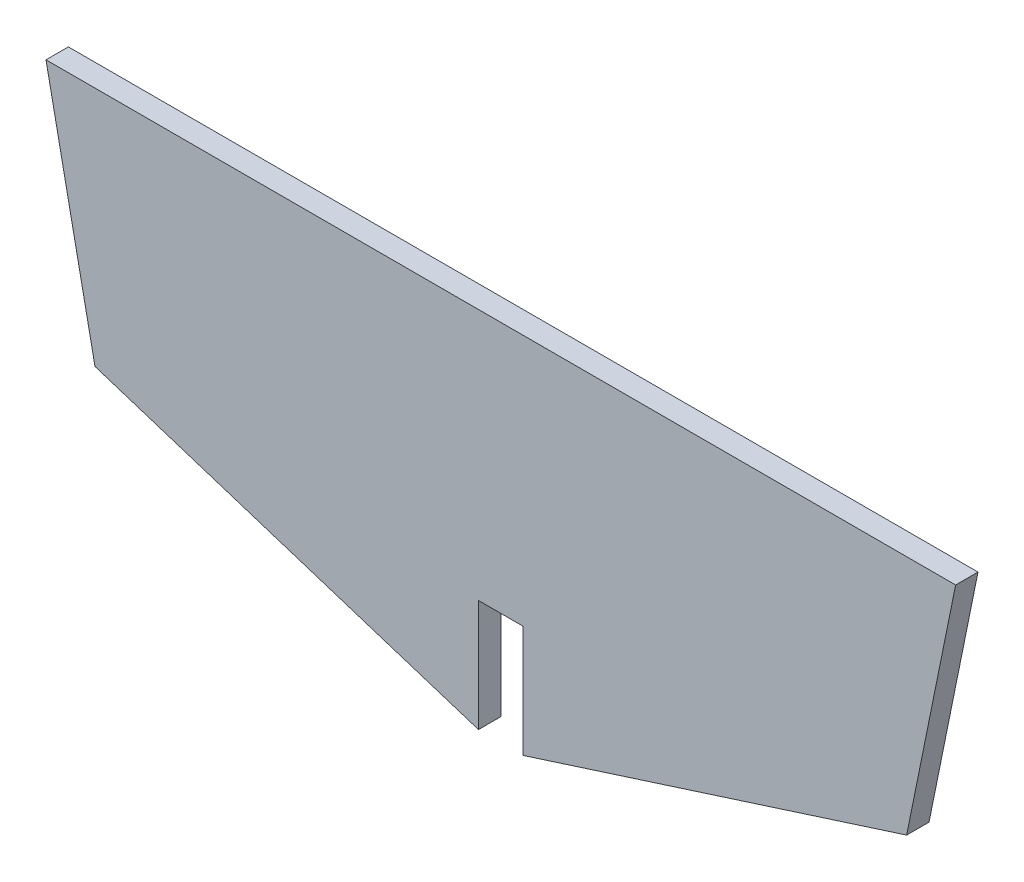
ISO-10303-21;
HEADER;
FILE_DESCRIPTION(('STEP AP214'),'2;1');
FILE_NAME('part.step','',(''),(''),'','','');
FILE_SCHEMA(('AUTOMOTIVE_DESIGN { 1 0 10303 214 1 1 1 1 }'));
ENDSEC;
DATA;
#1=APPLICATION_CONTEXT('core data for automotive mechanical design processes');
#2=APPLICATION_PROTOCOL_DEFINITION('international standard','automotive_design',2000,#1);
#3=PRODUCT_CONTEXT('',#1,'mechanical');
#4=PRODUCT('Part','Part','',(#3));
#5=PRODUCT_RELATED_PRODUCT_CATEGORY('part','',(#4));
#6=PRODUCT_DEFINITION_FORMATION('','',#4);
#7=PRODUCT_DEFINITION_CONTEXT('part definition',#1,'design');
#8=PRODUCT_DEFINITION('design','',#6,#7);
#9=PRODUCT_DEFINITION_SHAPE('','',#8);
#10=(LENGTH_UNIT() NAMED_UNIT(*) SI_UNIT(.MILLI.,.METRE.));
#11=(NAMED_UNIT(*) PLANE_ANGLE_UNIT() SI_UNIT($,.RADIAN.));
#12=(NAMED_UNIT(*) SI_UNIT($,.STERADIAN.) SOLID_ANGLE_UNIT());
#13=UNCERTAINTY_MEASURE_WITH_UNIT(LENGTH_MEASURE(1.E-05),#10,'distance_accuracy_value','');
#14=(GEOMETRIC_REPRESENTATION_CONTEXT(3) GLOBAL_UNCERTAINTY_ASSIGNED_CONTEXT((#13)) GLOBAL_UNIT_ASSIGNED_CONTEXT((#10,
#11,#12)) REPRESENTATION_CONTEXT('',''));
#15=CARTESIAN_POINT('',(0.,0.,0.));
#16=DIRECTION('',(0.,0.,1.));
#17=DIRECTION('',(1.,0.,0.));
#18=AXIS2_PLACEMENT_3D('',#15,#16,#17);
#19=CARTESIAN_POINT('',(-26.4234133480288,16.431604978547,3.));
#20=DIRECTION('',(0.979981210042111,0.199089999659449,0.));
#21=DIRECTION('',(-0.199089999659449,0.979981210042111,0.));
#22=AXIS2_PLACEMENT_3D('',#19,#20,#21);
#23=PLANE('',#22);
#24=DIRECTION('',(0.199089999659449,-0.979981210042111,0.));
#25=VECTOR('',#24,1.);
#26=CARTESIAN_POINT('',(-26.4234133480288,16.431604978547,0.));
#27=LINE('',#26,#25);
#28=CARTESIAN_POINT('',(-26.4234133480288,16.431604978547,0.));
#29=VERTEX_POINT('',#28);
#30=CARTESIAN_POINT('',(-19.853443359267,-15.9077749528427,0.));
#31=VERTEX_POINT('',#30);
#32=EDGE_CURVE('E130',#29,#31,#27,.T.);
#33=ORIENTED_EDGE('',*,*,#32,.T.);
#34=DIRECTION('',(0.,0.,-1.));
#35=VECTOR('',#34,1.);
#36=CARTESIAN_POINT('',(-19.853443359267,-15.9077749528427,3.));
#37=LINE('',#36,#35);
#38=CARTESIAN_POINT('',(-19.853443359267,-15.9077749528427,3.));
#39=VERTEX_POINT('',#38);
#40=EDGE_CURVE('E11',#39,#31,#37,.T.);
#41=ORIENTED_EDGE('',*,*,#40,.F.);
#42=DIRECTION('',(0.199089999659449,-0.979981210042111,0.));
#43=VECTOR('',#42,1.);
#44=CARTESIAN_POINT('',(-26.4234133480288,16.431604978547,3.));
#45=LINE('',#44,#43);
#46=CARTESIAN_POINT('',(-26.4234133480288,16.431604978547,3.));
#47=VERTEX_POINT('',#46);
#48=EDGE_CURVE('E144',#47,#39,#45,.T.);
#49=ORIENTED_EDGE('',*,*,#48,.F.);
#50=DIRECTION('',(0.,0.,-1.));
#51=VECTOR('',#50,1.);
#52=CARTESIAN_POINT('',(-26.4234133480288,16.431604978547,3.));
#53=LINE('',#52,#51);
#54=EDGE_CURVE('E126',#47,#29,#53,.T.);
#55=ORIENTED_EDGE('',*,*,#54,.T.);
#56=EDGE_LOOP('',(#33,#41,#49,#55));
#57=FACE_BOUND('',#56,.T.);
#58=ADVANCED_FACE('F34',(#57),#23,.F.);
#59=CARTESIAN_POINT('',(-19.853443359267,-15.9077749528427,3.));
#60=DIRECTION('',(0.304826297566858,0.952407963171078,0.));
#61=DIRECTION('',(-0.952407963171078,0.304826297566858,0.));
#62=AXIS2_PLACEMENT_3D('',#59,#60,#61);
#63=PLANE('',#62);
#64=DIRECTION('',(0.952407963171078,-0.304826297566858,0.));
#65=VECTOR('',#64,1.);
#66=CARTESIAN_POINT('',(-19.853443359267,-15.9077749528427,0.));
#67=LINE('',#66,#65);
#68=CARTESIAN_POINT('',(31.5765866519712,-32.368395021453,0.));
#69=VERTEX_POINT('',#68);
#70=EDGE_CURVE('E133',#31,#69,#67,.T.);
#71=ORIENTED_EDGE('',*,*,#70,.T.);
#72=DIRECTION('',(0.,0.,-1.));
#73=VECTOR('',#72,1.);
#74=CARTESIAN_POINT('',(31.5765866519712,-32.368395021453,3.));
#75=LINE('',#74,#73);
#76=CARTESIAN_POINT('',(31.5765866519712,-32.368395021453,3.));
#77=VERTEX_POINT('',#76);
#78=EDGE_CURVE('E42',#77,#69,#75,.T.);
#79=ORIENTED_EDGE('',*,*,#78,.F.);
#80=DIRECTION('',(0.952407963171078,-0.304826297566858,0.));
#81=VECTOR('',#80,1.);
#82=CARTESIAN_POINT('',(-19.853443359267,-15.9077749528427,3.));
#83=LINE('',#82,#81);
#84=EDGE_CURVE('E93',#39,#77,#83,.T.);
#85=ORIENTED_EDGE('',*,*,#84,.F.);
#86=ORIENTED_EDGE('',*,*,#40,.T.);
#87=EDGE_LOOP('',(#71,#79,#85,#86));
#88=FACE_BOUND('',#87,.T.);
#89=ADVANCED_FACE('F179',(#88),#63,.F.);
#90=CARTESIAN_POINT('',(31.5765866519712,-32.368395021453,3.));
#91=DIRECTION('',(-1.,0.,0.));
#92=DIRECTION('',(0.,0.,1.));
#93=AXIS2_PLACEMENT_3D('',#90,#91,#92);
#94=PLANE('',#93);
#95=DIRECTION('',(0.,1.,0.));
#96=VECTOR('',#95,1.);
#97=CARTESIAN_POINT('',(31.5765866519712,-32.368395021453,0.));
#98=LINE('',#97,#96);
#99=CARTESIAN_POINT('',(31.5765866519712,-17.368395021453,0.));
#100=VERTEX_POINT('',#99);
#101=EDGE_CURVE('E135',#69,#100,#98,.T.);
#102=ORIENTED_EDGE('',*,*,#101,.T.);
#103=DIRECTION('',(0.,0.,-1.));
#104=VECTOR('',#103,1.);
#105=CARTESIAN_POINT('',(31.5765866519712,-17.368395021453,3.));
#106=LINE('',#105,#104);
#107=CARTESIAN_POINT('',(31.5765866519712,-17.368395021453,3.));
#108=VERTEX_POINT('',#107);
#109=EDGE_CURVE('E151',#108,#100,#106,.T.);
#110=ORIENTED_EDGE('',*,*,#109,.F.);
#111=DIRECTION('',(0.,1.,0.));
#112=VECTOR('',#111,1.);
#113=CARTESIAN_POINT('',(31.5765866519712,-32.368395021453,3.));
#114=LINE('',#113,#112);
#115=EDGE_CURVE('E159',#77,#108,#114,.T.);
#116=ORIENTED_EDGE('',*,*,#115,.F.);
#117=ORIENTED_EDGE('',*,*,#78,.T.);
#118=EDGE_LOOP('',(#102,#110,#116,#117));
#119=FACE_BOUND('',#118,.T.);
#120=ADVANCED_FACE('F157',(#119),#94,.F.);
#121=CARTESIAN_POINT('',(31.5765866519712,-17.368395021453,3.));
#122=DIRECTION('',(0.,1.,0.));
#123=DIRECTION('',(0.,0.,1.));
#124=AXIS2_PLACEMENT_3D('',#121,#122,#123);
#125=PLANE('',#124);
#126=DIRECTION('',(1.,0.,0.));
#127=VECTOR('',#126,1.);
#128=CARTESIAN_POINT('',(31.5765866519712,-17.368395021453,0.));
#129=LINE('',#128,#127);
#130=CARTESIAN_POINT('',(37.5765866519712,-17.368395021453,0.));
#131=VERTEX_POINT('',#130);
#132=EDGE_CURVE('E137',#100,#131,#129,.T.);
#133=ORIENTED_EDGE('',*,*,#132,.T.);
#134=DIRECTION('',(0.,0.,-1.));
#135=VECTOR('',#134,1.);
#136=CARTESIAN_POINT('',(37.5765866519712,-17.368395021453,3.));
#137=LINE('',#136,#135);
#138=CARTESIAN_POINT('',(37.5765866519712,-17.368395021453,3.));
#139=VERTEX_POINT('',#138);
#140=EDGE_CURVE('E148',#139,#131,#137,.T.);
#141=ORIENTED_EDGE('',*,*,#140,.F.);
#142=DIRECTION('',(1.,0.,0.));
#143=VECTOR('',#142,1.);
#144=CARTESIAN_POINT('',(31.5765866519712,-17.368395021453,3.));
#145=LINE('',#144,#143);
#146=EDGE_CURVE('E171',#108,#139,#145,.T.);
#147=ORIENTED_EDGE('',*,*,#146,.F.);
#148=ORIENTED_EDGE('',*,*,#109,.T.);
#149=EDGE_LOOP('',(#133,#141,#147,#148));
#150=FACE_BOUND('',#149,.T.);
#151=ADVANCED_FACE('F167',(#150),#125,.F.);
#152=CARTESIAN_POINT('',(37.5765866519712,-32.368395021453,3.));
#153=DIRECTION('',(1.,0.,0.));
#154=DIRECTION('',(0.,1.,0.));
#155=AXIS2_PLACEMENT_3D('',#152,#153,#154);
#156=PLANE('',#155);
#157=DIRECTION('',(0.,-1.,0.));
#158=VECTOR('',#157,1.);
#159=CARTESIAN_POINT('',(37.5765866519712,-32.368395021453,0.));
#160=LINE('',#159,#158);
#161=CARTESIAN_POINT('',(37.5765866519712,-32.368395021453,0.));
#162=VERTEX_POINT('',#161);
#163=EDGE_CURVE('E139',#131,#162,#160,.T.);
#164=ORIENTED_EDGE('',*,*,#163,.T.);
#165=DIRECTION('',(0.,0.,-1.));
#166=VECTOR('',#165,1.);
#167=CARTESIAN_POINT('',(37.5765866519712,-32.368395021453,3.));
#168=LINE('',#167,#166);
#169=CARTESIAN_POINT('',(37.5765866519712,-32.368395021453,3.));
#170=VERTEX_POINT('',#169);
#171=EDGE_CURVE('E121',#170,#162,#168,.T.);
#172=ORIENTED_EDGE('',*,*,#171,.F.);
#173=DIRECTION('',(0.,-1.,0.));
#174=VECTOR('',#173,1.);
#175=CARTESIAN_POINT('',(37.5765866519712,-32.368395021453,3.));
#176=LINE('',#175,#174);
#177=EDGE_CURVE('E112',#139,#170,#176,.T.);
#178=ORIENTED_EDGE('',*,*,#177,.F.);
#179=ORIENTED_EDGE('',*,*,#140,.T.);
#180=EDGE_LOOP('',(#164,#172,#178,#179));
#181=FACE_BOUND('',#180,.T.);
#182=ADVANCED_FACE('F170',(#181),#156,.F.);
#183=CARTESIAN_POINT('',(89.0066166632094,-15.9077749528427,3.));
#184=DIRECTION('',(-0.304826297566858,0.952407963171078,0.));
#185=DIRECTION('',(-0.952407963171078,-0.304826297566858,0.));
#186=AXIS2_PLACEMENT_3D('',#183,#184,#185);
#187=PLANE('',#186);
#188=DIRECTION('',(0.952407963171078,0.304826297566858,0.));
#189=VECTOR('',#188,1.);
#190=CARTESIAN_POINT('',(89.0066166632094,-15.9077749528427,0.));
#191=LINE('',#190,#189);
#192=CARTESIAN_POINT('',(89.0066166632094,-15.9077749528427,0.));
#193=VERTEX_POINT('',#192);
#194=EDGE_CURVE('E120',#162,#193,#191,.T.);
#195=ORIENTED_EDGE('',*,*,#194,.T.);
#196=DIRECTION('',(0.,0.,-1.));
#197=VECTOR('',#196,1.);
#198=CARTESIAN_POINT('',(89.0066166632094,-15.9077749528427,3.));
#199=LINE('',#198,#197);
#200=CARTESIAN_POINT('',(89.0066166632094,-15.9077749528427,3.));
#201=VERTEX_POINT('',#200);
#202=EDGE_CURVE('E117',#201,#193,#199,.T.);
#203=ORIENTED_EDGE('',*,*,#202,.F.);
#204=DIRECTION('',(0.952407963171078,0.304826297566858,0.));
#205=VECTOR('',#204,1.);
#206=CARTESIAN_POINT('',(89.0066166632094,-15.9077749528427,3.));
#207=LINE('',#206,#205);
#208=EDGE_CURVE('E106',#170,#201,#207,.T.);
#209=ORIENTED_EDGE('',*,*,#208,.F.);
#210=ORIENTED_EDGE('',*,*,#171,.T.);
#211=EDGE_LOOP('',(#195,#203,#209,#210));
#212=FACE_BOUND('',#211,.T.);
#213=ADVANCED_FACE('F118',(#212),#187,.F.);
#214=CARTESIAN_POINT('',(95.5765866519712,16.431604978547,3.));
#215=DIRECTION('',(-0.979981210042111,0.199089999659448,0.));
#216=DIRECTION('',(-0.199089999659448,-0.979981210042112,0.));
#217=AXIS2_PLACEMENT_3D('',#214,#215,#216);
#218=PLANE('',#217);
#219=DIRECTION('',(0.199089999659448,0.979981210042112,0.));
#220=VECTOR('',#219,1.);
#221=CARTESIAN_POINT('',(95.5765866519712,16.431604978547,0.));
#222=LINE('',#221,#220);
#223=CARTESIAN_POINT('',(95.5765866519712,16.431604978547,0.));
#224=VERTEX_POINT('',#223);
#225=EDGE_CURVE('E79',#193,#224,#222,.T.);
#226=ORIENTED_EDGE('',*,*,#225,.T.);
#227=DIRECTION('',(0.,0.,-1.));
#228=VECTOR('',#227,1.);
#229=CARTESIAN_POINT('',(95.5765866519712,16.431604978547,3.));
#230=LINE('',#229,#228);
#231=CARTESIAN_POINT('',(95.5765866519712,16.431604978547,3.));
#232=VERTEX_POINT('',#231);
#233=EDGE_CURVE('E122',#232,#224,#230,.T.);
#234=ORIENTED_EDGE('',*,*,#233,.F.);
#235=DIRECTION('',(0.199089999659448,0.979981210042112,0.));
#236=VECTOR('',#235,1.);
#237=CARTESIAN_POINT('',(95.5765866519712,16.431604978547,3.));
#238=LINE('',#237,#236);
#239=EDGE_CURVE('E110',#201,#232,#238,.T.);
#240=ORIENTED_EDGE('',*,*,#239,.F.);
#241=ORIENTED_EDGE('',*,*,#202,.T.);
#242=EDGE_LOOP('',(#226,#234,#240,#241));
#243=FACE_BOUND('',#242,.T.);
#244=ADVANCED_FACE('F124',(#243),#218,.F.);
#245=CARTESIAN_POINT('',(-26.4234133480288,16.431604978547,3.));
#246=DIRECTION('',(0.,-1.,0.));
#247=DIRECTION('',(1.,0.,0.));
#248=AXIS2_PLACEMENT_3D('',#245,#246,#247);
#249=PLANE('',#248);
#250=DIRECTION('',(-1.,0.,0.));
#251=VECTOR('',#250,1.);
#252=CARTESIAN_POINT('',(-26.4234133480288,16.431604978547,0.));
#253=LINE('',#252,#251);
#254=EDGE_CURVE('E85',#224,#29,#253,.T.);
#255=ORIENTED_EDGE('',*,*,#254,.T.);
#256=ORIENTED_EDGE('',*,*,#54,.F.);
#257=DIRECTION('',(-1.,0.,0.));
#258=VECTOR('',#257,1.);
#259=CARTESIAN_POINT('',(-26.4234133480288,16.431604978547,3.));
#260=LINE('',#259,#258);
#261=EDGE_CURVE('E50',#232,#47,#260,.T.);
#262=ORIENTED_EDGE('',*,*,#261,.F.);
#263=ORIENTED_EDGE('',*,*,#233,.T.);
#264=EDGE_LOOP('',(#255,#256,#262,#263));
#265=FACE_BOUND('',#264,.T.);
#266=ADVANCED_FACE('F195',(#265),#249,.F.);
#267=CARTESIAN_POINT('',(0.,0.,3.));
#268=DIRECTION('',(0.,0.,-1.));
#269=DIRECTION('',(-1.,0.,0.));
#270=AXIS2_PLACEMENT_3D('',#267,#268,#269);
#271=PLANE('',#270);
#272=ORIENTED_EDGE('',*,*,#48,.T.);
#273=ORIENTED_EDGE('',*,*,#84,.T.);
#274=ORIENTED_EDGE('',*,*,#115,.T.);
#275=ORIENTED_EDGE('',*,*,#146,.T.);
#276=ORIENTED_EDGE('',*,*,#177,.T.);
#277=ORIENTED_EDGE('',*,*,#208,.T.);
#278=ORIENTED_EDGE('',*,*,#239,.T.);
#279=ORIENTED_EDGE('',*,*,#261,.T.);
#280=EDGE_LOOP('',(#272,#273,#274,#275,#276,#277,#278,#279));
#281=FACE_BOUND('',#280,.T.);
#282=ADVANCED_FACE('F108',(#281),#271,.F.);
#283=CARTESIAN_POINT('',(0.,0.,0.));
#284=DIRECTION('',(0.,0.,-1.));
#285=DIRECTION('',(-1.,0.,0.));
#286=AXIS2_PLACEMENT_3D('',#283,#284,#285);
#287=PLANE('',#286);
#288=ORIENTED_EDGE('',*,*,#32,.F.);
#289=ORIENTED_EDGE('',*,*,#254,.F.);
#290=ORIENTED_EDGE('',*,*,#225,.F.);
#291=ORIENTED_EDGE('',*,*,#194,.F.);
#292=ORIENTED_EDGE('',*,*,#163,.F.);
#293=ORIENTED_EDGE('',*,*,#132,.F.);
#294=ORIENTED_EDGE('',*,*,#101,.F.);
#295=ORIENTED_EDGE('',*,*,#70,.F.);
#296=EDGE_LOOP('',(#288,#289,#290,#291,#292,#293,#294,#295));
#297=FACE_BOUND('',#296,.T.);
#298=ADVANCED_FACE('F163',(#297),#287,.T.);
#299=CLOSED_SHELL('',(#58,#89,#120,#151,#182,#213,#244,#266,#282,#298));
#300=MANIFOLD_SOLID_BREP('B2',#299);
#301=ADVANCED_BREP_SHAPE_REPRESENTATION('',(#18,#300),#14);
#302=SHAPE_DEFINITION_REPRESENTATION(#9,#301);
ENDSEC;
END-ISO-10303-21;
